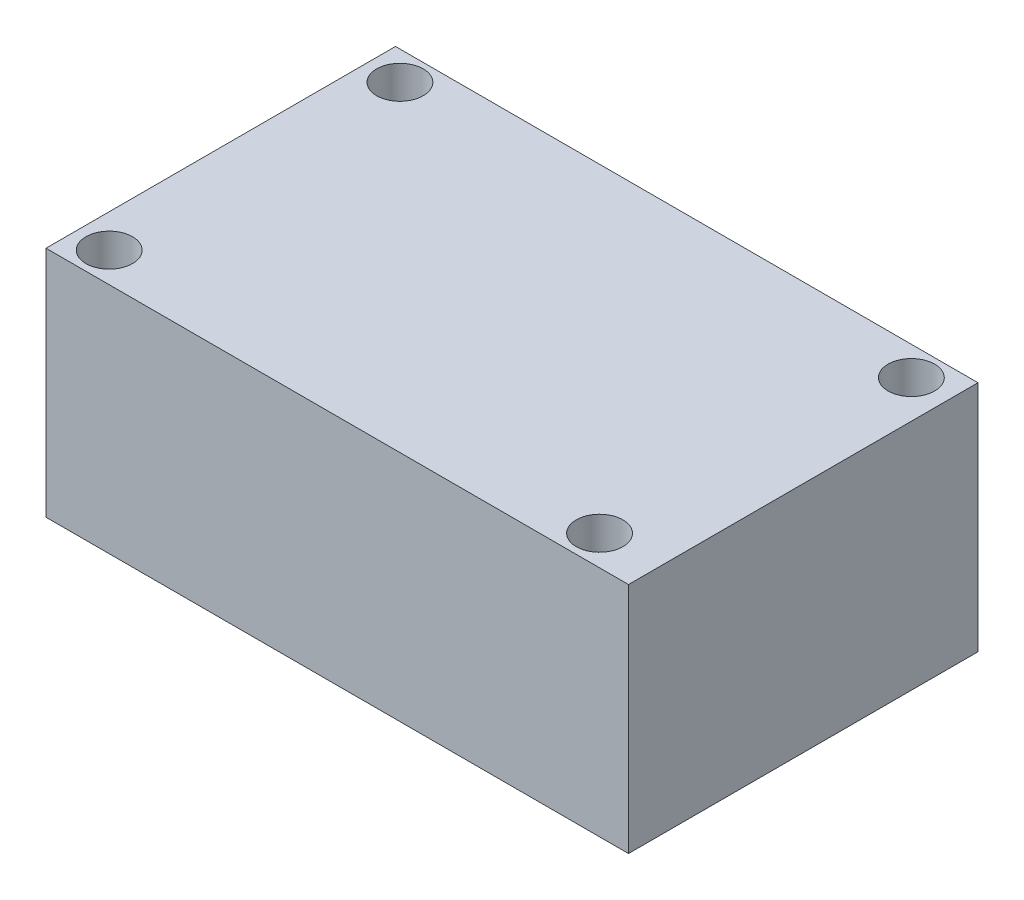
ISO-10303-21;
HEADER;
FILE_DESCRIPTION(('STEP AP214'),'2;1');
FILE_NAME('part.step','',(''),(''),'','','');
FILE_SCHEMA(('AUTOMOTIVE_DESIGN { 1 0 10303 214 1 1 1 1 }'));
ENDSEC;
DATA;
#1=APPLICATION_CONTEXT('core data for automotive mechanical design processes');
#2=APPLICATION_PROTOCOL_DEFINITION('international standard','automotive_design',2000,#1);
#3=PRODUCT_CONTEXT('',#1,'mechanical');
#4=PRODUCT('Part','Part','',(#3));
#5=PRODUCT_RELATED_PRODUCT_CATEGORY('part','',(#4));
#6=PRODUCT_DEFINITION_FORMATION('','',#4);
#7=PRODUCT_DEFINITION_CONTEXT('part definition',#1,'design');
#8=PRODUCT_DEFINITION('design','',#6,#7);
#9=PRODUCT_DEFINITION_SHAPE('','',#8);
#10=(LENGTH_UNIT() NAMED_UNIT(*) SI_UNIT(.MILLI.,.METRE.));
#11=(NAMED_UNIT(*) PLANE_ANGLE_UNIT() SI_UNIT($,.RADIAN.));
#12=(NAMED_UNIT(*) SI_UNIT($,.STERADIAN.) SOLID_ANGLE_UNIT());
#13=UNCERTAINTY_MEASURE_WITH_UNIT(LENGTH_MEASURE(1.E-05),#10,'distance_accuracy_value','');
#14=(GEOMETRIC_REPRESENTATION_CONTEXT(3) GLOBAL_UNCERTAINTY_ASSIGNED_CONTEXT((#13)) GLOBAL_UNIT_ASSIGNED_CONTEXT((#10,
#11,#12)) REPRESENTATION_CONTEXT('',''));
#15=CARTESIAN_POINT('',(0.,0.,0.));
#16=DIRECTION('',(0.,0.,1.));
#17=DIRECTION('',(1.,0.,0.));
#18=AXIS2_PLACEMENT_3D('',#15,#16,#17);
#19=CARTESIAN_POINT('',(-14.58203125,10.,-5.783203125));
#20=DIRECTION('',(1.,0.,0.));
#21=DIRECTION('',(0.,0.,-1.));
#22=AXIS2_PLACEMENT_3D('',#19,#20,#21);
#23=PLANE('',#22);
#24=DIRECTION('',(0.,0.,1.));
#25=VECTOR('',#24,1.);
#26=CARTESIAN_POINT('',(-14.58203125,0.,-5.783203125));
#27=LINE('',#26,#25);
#28=CARTESIAN_POINT('',(-14.58203125,0.,-5.783203125));
#29=VERTEX_POINT('',#28);
#30=CARTESIAN_POINT('',(-14.58203125,0.,9.216796875));
#31=VERTEX_POINT('',#30);
#32=EDGE_CURVE('E107',#29,#31,#27,.T.);
#33=ORIENTED_EDGE('',*,*,#32,.T.);
#34=DIRECTION('',(0.,-1.,0.));
#35=VECTOR('',#34,1.);
#36=CARTESIAN_POINT('',(-14.58203125,10.,9.216796875));
#37=LINE('',#36,#35);
#38=CARTESIAN_POINT('',(-14.58203125,10.,9.216796875));
#39=VERTEX_POINT('',#38);
#40=EDGE_CURVE('E11',#39,#31,#37,.T.);
#41=ORIENTED_EDGE('',*,*,#40,.F.);
#42=DIRECTION('',(0.,0.,1.));
#43=VECTOR('',#42,1.);
#44=CARTESIAN_POINT('',(-14.58203125,10.,-5.783203125));
#45=LINE('',#44,#43);
#46=CARTESIAN_POINT('',(-14.58203125,10.,-5.783203125));
#47=VERTEX_POINT('',#46);
#48=EDGE_CURVE('E91',#47,#39,#45,.T.);
#49=ORIENTED_EDGE('',*,*,#48,.F.);
#50=DIRECTION('',(0.,-1.,0.));
#51=VECTOR('',#50,1.);
#52=CARTESIAN_POINT('',(-14.58203125,10.,-5.783203125));
#53=LINE('',#52,#51);
#54=EDGE_CURVE('E103',#47,#29,#53,.T.);
#55=ORIENTED_EDGE('',*,*,#54,.T.);
#56=EDGE_LOOP('',(#33,#41,#49,#55));
#57=FACE_BOUND('',#56,.T.);
#58=ADVANCED_FACE('F39',(#57),#23,.F.);
#59=CARTESIAN_POINT('',(-14.58203125,10.,9.216796875));
#60=DIRECTION('',(0.,0.,-1.));
#61=DIRECTION('',(-1.,0.,0.));
#62=AXIS2_PLACEMENT_3D('',#59,#60,#61);
#63=PLANE('',#62);
#64=DIRECTION('',(1.,0.,0.));
#65=VECTOR('',#64,1.);
#66=CARTESIAN_POINT('',(-14.58203125,0.,9.216796875));
#67=LINE('',#66,#65);
#68=CARTESIAN_POINT('',(10.41796875,0.,9.216796875));
#69=VERTEX_POINT('',#68);
#70=EDGE_CURVE('E96',#31,#69,#67,.T.);
#71=ORIENTED_EDGE('',*,*,#70,.T.);
#72=DIRECTION('',(0.,-1.,0.));
#73=VECTOR('',#72,1.);
#74=CARTESIAN_POINT('',(10.41796875,10.,9.216796875));
#75=LINE('',#74,#73);
#76=CARTESIAN_POINT('',(10.41796875,10.,9.216796875));
#77=VERTEX_POINT('',#76);
#78=EDGE_CURVE('E48',#77,#69,#75,.T.);
#79=ORIENTED_EDGE('',*,*,#78,.F.);
#80=DIRECTION('',(1.,0.,0.));
#81=VECTOR('',#80,1.);
#82=CARTESIAN_POINT('',(-14.58203125,10.,9.216796875));
#83=LINE('',#82,#81);
#84=EDGE_CURVE('E86',#39,#77,#83,.T.);
#85=ORIENTED_EDGE('',*,*,#84,.F.);
#86=ORIENTED_EDGE('',*,*,#40,.T.);
#87=EDGE_LOOP('',(#71,#79,#85,#86));
#88=FACE_BOUND('',#87,.T.);
#89=ADVANCED_FACE('F95',(#88),#63,.F.);
#90=CARTESIAN_POINT('',(10.41796875,10.,-5.783203125));
#91=DIRECTION('',(-1.,0.,0.));
#92=DIRECTION('',(0.,0.,1.));
#93=AXIS2_PLACEMENT_3D('',#90,#91,#92);
#94=PLANE('',#93);
#95=DIRECTION('',(0.,0.,-1.));
#96=VECTOR('',#95,1.);
#97=CARTESIAN_POINT('',(10.41796875,0.,-5.783203125));
#98=LINE('',#97,#96);
#99=CARTESIAN_POINT('',(10.41796875,0.,-5.783203125));
#100=VERTEX_POINT('',#99);
#101=EDGE_CURVE('E73',#69,#100,#98,.T.);
#102=ORIENTED_EDGE('',*,*,#101,.T.);
#103=DIRECTION('',(0.,-1.,0.));
#104=VECTOR('',#103,1.);
#105=CARTESIAN_POINT('',(10.41796875,10.,-5.783203125));
#106=LINE('',#105,#104);
#107=CARTESIAN_POINT('',(10.41796875,10.,-5.783203125));
#108=VERTEX_POINT('',#107);
#109=EDGE_CURVE('E98',#108,#100,#106,.T.);
#110=ORIENTED_EDGE('',*,*,#109,.F.);
#111=DIRECTION('',(0.,0.,-1.));
#112=VECTOR('',#111,1.);
#113=CARTESIAN_POINT('',(10.41796875,10.,-5.783203125));
#114=LINE('',#113,#112);
#115=EDGE_CURVE('E89',#77,#108,#114,.T.);
#116=ORIENTED_EDGE('',*,*,#115,.F.);
#117=ORIENTED_EDGE('',*,*,#78,.T.);
#118=EDGE_LOOP('',(#102,#110,#116,#117));
#119=FACE_BOUND('',#118,.T.);
#120=ADVANCED_FACE('F99',(#119),#94,.F.);
#121=CARTESIAN_POINT('',(-14.58203125,10.,-5.783203125));
#122=DIRECTION('',(0.,0.,1.));
#123=DIRECTION('',(1.,0.,0.));
#124=AXIS2_PLACEMENT_3D('',#121,#122,#123);
#125=PLANE('',#124);
#126=DIRECTION('',(-1.,0.,0.));
#127=VECTOR('',#126,1.);
#128=CARTESIAN_POINT('',(-14.58203125,0.,-5.783203125));
#129=LINE('',#128,#127);
#130=EDGE_CURVE('E79',#100,#29,#129,.T.);
#131=ORIENTED_EDGE('',*,*,#130,.T.);
#132=ORIENTED_EDGE('',*,*,#54,.F.);
#133=DIRECTION('',(-1.,0.,0.));
#134=VECTOR('',#133,1.);
#135=CARTESIAN_POINT('',(-14.58203125,10.,-5.783203125));
#136=LINE('',#135,#134);
#137=EDGE_CURVE('E56',#108,#47,#136,.T.);
#138=ORIENTED_EDGE('',*,*,#137,.F.);
#139=ORIENTED_EDGE('',*,*,#109,.T.);
#140=EDGE_LOOP('',(#131,#132,#138,#139));
#141=FACE_BOUND('',#140,.T.);
#142=ADVANCED_FACE('F121',(#141),#125,.F.);
#143=CARTESIAN_POINT('',(0.,10.,0.));
#144=DIRECTION('',(0.,1.,0.));
#145=DIRECTION('',(0.,0.,1.));
#146=AXIS2_PLACEMENT_3D('',#143,#144,#145);
#147=PLANE('',#146);
#148=CARTESIAN_POINT('',(-13.1539353140511,10.,7.93234222135197));
#149=DIRECTION('',(0.,1.,0.));
#150=DIRECTION('',(0.,0.,1.));
#151=AXIS2_PLACEMENT_3D('',#148,#149,#150);
#152=CIRCLE('',#151,1.);
#153=CARTESIAN_POINT('',(-13.1539353140511,10.,8.93234222135197));
#154=VERTEX_POINT('',#153);
#155=EDGE_CURVE('E145',#154,#154,#152,.T.);
#156=ORIENTED_EDGE('',*,*,#155,.F.);
#157=EDGE_LOOP('',(#156));
#158=FACE_BOUND('',#157,.T.);
#159=CARTESIAN_POINT('',(8.79552625426783,10.,-4.54552098949534));
#160=DIRECTION('',(0.,1.,0.));
#161=DIRECTION('',(0.,0.,1.));
#162=AXIS2_PLACEMENT_3D('',#159,#160,#161);
#163=CIRCLE('',#162,1.);
#164=CARTESIAN_POINT('',(8.79552625426783,10.,-3.54552098949534));
#165=VERTEX_POINT('',#164);
#166=EDGE_CURVE('E136',#165,#165,#163,.T.);
#167=ORIENTED_EDGE('',*,*,#166,.F.);
#168=EDGE_LOOP('',(#167));
#169=FACE_BOUND('',#168,.T.);
#170=CARTESIAN_POINT('',(7.89115320839447,10.,7.93234222135197));
#171=DIRECTION('',(0.,1.,0.));
#172=DIRECTION('',(0.,0.,1.));
#173=AXIS2_PLACEMENT_3D('',#170,#171,#172);
#174=CIRCLE('',#173,1.);
#175=CARTESIAN_POINT('',(7.89115320839447,10.,8.93234222135197));
#176=VERTEX_POINT('',#175);
#177=EDGE_CURVE('E152',#176,#176,#174,.T.);
#178=ORIENTED_EDGE('',*,*,#177,.F.);
#179=EDGE_LOOP('',(#178));
#180=FACE_BOUND('',#179,.T.);
#181=CARTESIAN_POINT('',(-13.1539353140511,10.,-4.54552098949534));
#182=DIRECTION('',(0.,1.,0.));
#183=DIRECTION('',(0.,0.,1.));
#184=AXIS2_PLACEMENT_3D('',#181,#182,#183);
#185=CIRCLE('',#184,1.);
#186=CARTESIAN_POINT('',(-13.1539353140511,10.,-3.54552098949534));
#187=VERTEX_POINT('',#186);
#188=EDGE_CURVE('E128',#187,#187,#185,.T.);
#189=ORIENTED_EDGE('',*,*,#188,.F.);
#190=EDGE_LOOP('',(#189));
#191=FACE_BOUND('',#190,.T.);
#192=ORIENTED_EDGE('',*,*,#48,.T.);
#193=ORIENTED_EDGE('',*,*,#84,.T.);
#194=ORIENTED_EDGE('',*,*,#115,.T.);
#195=ORIENTED_EDGE('',*,*,#137,.T.);
#196=EDGE_LOOP('',(#192,#193,#194,#195));
#197=FACE_BOUND('',#196,.T.);
#198=ADVANCED_FACE('F87',(#158,#169,#180,#191,#197),#147,.T.);
#199=CARTESIAN_POINT('',(0.,0.,0.));
#200=DIRECTION('',(0.,1.,0.));
#201=DIRECTION('',(0.,0.,1.));
#202=AXIS2_PLACEMENT_3D('',#199,#200,#201);
#203=PLANE('',#202);
#204=CARTESIAN_POINT('',(-13.1539353140511,0.,7.93234222135197));
#205=DIRECTION('',(0.,1.,0.));
#206=DIRECTION('',(0.,0.,1.));
#207=AXIS2_PLACEMENT_3D('',#204,#205,#206);
#208=CIRCLE('',#207,1.);
#209=CARTESIAN_POINT('',(-13.1539353140511,0.,8.93234222135197));
#210=VERTEX_POINT('',#209);
#211=EDGE_CURVE('E132',#210,#210,#208,.T.);
#212=ORIENTED_EDGE('',*,*,#211,.T.);
#213=EDGE_LOOP('',(#212));
#214=FACE_BOUND('',#213,.T.);
#215=CARTESIAN_POINT('',(8.79552625426783,0.,-4.54552098949534));
#216=DIRECTION('',(0.,1.,0.));
#217=DIRECTION('',(0.,0.,1.));
#218=AXIS2_PLACEMENT_3D('',#215,#216,#217);
#219=CIRCLE('',#218,1.);
#220=CARTESIAN_POINT('',(8.79552625426783,0.,-3.54552098949534));
#221=VERTEX_POINT('',#220);
#222=EDGE_CURVE('E140',#221,#221,#219,.T.);
#223=ORIENTED_EDGE('',*,*,#222,.T.);
#224=EDGE_LOOP('',(#223));
#225=FACE_BOUND('',#224,.T.);
#226=CARTESIAN_POINT('',(7.89115320839447,0.,7.93234222135197));
#227=DIRECTION('',(0.,1.,0.));
#228=DIRECTION('',(0.,0.,1.));
#229=AXIS2_PLACEMENT_3D('',#226,#227,#228);
#230=CIRCLE('',#229,1.);
#231=CARTESIAN_POINT('',(7.89115320839447,0.,8.93234222135197));
#232=VERTEX_POINT('',#231);
#233=EDGE_CURVE('E141',#232,#232,#230,.T.);
#234=ORIENTED_EDGE('',*,*,#233,.T.);
#235=EDGE_LOOP('',(#234));
#236=FACE_BOUND('',#235,.T.);
#237=CARTESIAN_POINT('',(-13.1539353140511,0.,-4.54552098949534));
#238=DIRECTION('',(0.,1.,0.));
#239=DIRECTION('',(0.,0.,1.));
#240=AXIS2_PLACEMENT_3D('',#237,#238,#239);
#241=CIRCLE('',#240,1.);
#242=CARTESIAN_POINT('',(-13.1539353140511,0.,-3.54552098949534));
#243=VERTEX_POINT('',#242);
#244=EDGE_CURVE('E111',#243,#243,#241,.T.);
#245=ORIENTED_EDGE('',*,*,#244,.T.);
#246=EDGE_LOOP('',(#245));
#247=FACE_BOUND('',#246,.T.);
#248=ORIENTED_EDGE('',*,*,#32,.F.);
#249=ORIENTED_EDGE('',*,*,#130,.F.);
#250=ORIENTED_EDGE('',*,*,#101,.F.);
#251=ORIENTED_EDGE('',*,*,#70,.F.);
#252=EDGE_LOOP('',(#248,#249,#250,#251));
#253=FACE_BOUND('',#252,.T.);
#254=ADVANCED_FACE('F124',(#214,#225,#236,#247,#253),#203,.F.);
#255=CARTESIAN_POINT('',(-13.1539353140511,0.,-4.54552098949534));
#256=DIRECTION('',(0.,1.,0.));
#257=DIRECTION('',(0.,0.,1.));
#258=AXIS2_PLACEMENT_3D('',#255,#256,#257);
#259=CYLINDRICAL_SURFACE('',#258,1.);
#260=ORIENTED_EDGE('',*,*,#244,.F.);
#261=EDGE_LOOP('',(#260));
#262=FACE_BOUND('',#261,.T.);
#263=ORIENTED_EDGE('',*,*,#188,.T.);
#264=EDGE_LOOP('',(#263));
#265=FACE_BOUND('',#264,.T.);
#266=ADVANCED_FACE('F166',(#262,#265),#259,.F.);
#267=CARTESIAN_POINT('',(7.89115320839447,0.,7.93234222135197));
#268=DIRECTION('',(0.,1.,0.));
#269=DIRECTION('',(0.,0.,1.));
#270=AXIS2_PLACEMENT_3D('',#267,#268,#269);
#271=CYLINDRICAL_SURFACE('',#270,1.);
#272=ORIENTED_EDGE('',*,*,#233,.F.);
#273=EDGE_LOOP('',(#272));
#274=FACE_BOUND('',#273,.T.);
#275=ORIENTED_EDGE('',*,*,#177,.T.);
#276=EDGE_LOOP('',(#275));
#277=FACE_BOUND('',#276,.T.);
#278=ADVANCED_FACE('F162',(#274,#277),#271,.F.);
#279=CARTESIAN_POINT('',(8.79552625426783,0.,-4.54552098949534));
#280=DIRECTION('',(0.,1.,0.));
#281=DIRECTION('',(0.,0.,1.));
#282=AXIS2_PLACEMENT_3D('',#279,#280,#281);
#283=CYLINDRICAL_SURFACE('',#282,1.);
#284=ORIENTED_EDGE('',*,*,#222,.F.);
#285=EDGE_LOOP('',(#284));
#286=FACE_BOUND('',#285,.T.);
#287=ORIENTED_EDGE('',*,*,#166,.T.);
#288=EDGE_LOOP('',(#287));
#289=FACE_BOUND('',#288,.T.);
#290=ADVANCED_FACE('F165',(#286,#289),#283,.F.);
#291=CARTESIAN_POINT('',(-13.1539353140511,0.,7.93234222135197));
#292=DIRECTION('',(0.,1.,0.));
#293=DIRECTION('',(0.,0.,1.));
#294=AXIS2_PLACEMENT_3D('',#291,#292,#293);
#295=CYLINDRICAL_SURFACE('',#294,1.);
#296=ORIENTED_EDGE('',*,*,#211,.F.);
#297=EDGE_LOOP('',(#296));
#298=FACE_BOUND('',#297,.T.);
#299=ORIENTED_EDGE('',*,*,#155,.T.);
#300=EDGE_LOOP('',(#299));
#301=FACE_BOUND('',#300,.T.);
#302=ADVANCED_FACE('F227',(#298,#301),#295,.F.);
#303=CLOSED_SHELL('',(#58,#89,#120,#142,#198,#254,#266,#278,#290,#302));
#304=MANIFOLD_SOLID_BREP('B2',#303);
#305=ADVANCED_BREP_SHAPE_REPRESENTATION('',(#18,#304),#14);
#306=SHAPE_DEFINITION_REPRESENTATION(#9,#305);
ENDSEC;
END-ISO-10303-21;
